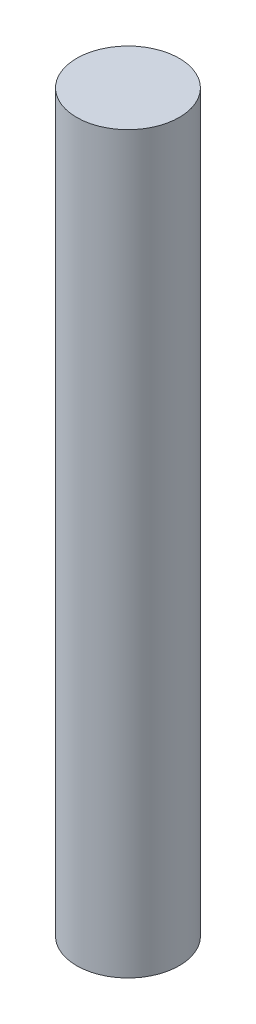
ISO-10303-21;
HEADER;
FILE_DESCRIPTION(('STEP AP214'),'2;1');
FILE_NAME('part.step','',(''),(''),'','','');
FILE_SCHEMA(('AUTOMOTIVE_DESIGN { 1 0 10303 214 1 1 1 1 }'));
ENDSEC;
DATA;
#1=APPLICATION_CONTEXT('core data for automotive mechanical design processes');
#2=APPLICATION_PROTOCOL_DEFINITION('international standard','automotive_design',2000,#1);
#3=PRODUCT_CONTEXT('',#1,'mechanical');
#4=PRODUCT('Part','Part','',(#3));
#5=PRODUCT_RELATED_PRODUCT_CATEGORY('part','',(#4));
#6=PRODUCT_DEFINITION_FORMATION('','',#4);
#7=PRODUCT_DEFINITION_CONTEXT('part definition',#1,'design');
#8=PRODUCT_DEFINITION('design','',#6,#7);
#9=PRODUCT_DEFINITION_SHAPE('','',#8);
#10=(LENGTH_UNIT() NAMED_UNIT(*) SI_UNIT(.MILLI.,.METRE.));
#11=(NAMED_UNIT(*) PLANE_ANGLE_UNIT() SI_UNIT($,.RADIAN.));
#12=(NAMED_UNIT(*) SI_UNIT($,.STERADIAN.) SOLID_ANGLE_UNIT());
#13=UNCERTAINTY_MEASURE_WITH_UNIT(LENGTH_MEASURE(1.E-05),#10,'distance_accuracy_value','');
#14=(GEOMETRIC_REPRESENTATION_CONTEXT(3) GLOBAL_UNCERTAINTY_ASSIGNED_CONTEXT((#13)) GLOBAL_UNIT_ASSIGNED_CONTEXT((#10,
#11,#12)) REPRESENTATION_CONTEXT('',''));
#15=CARTESIAN_POINT('',(0.,0.,0.));
#16=DIRECTION('',(0.,0.,1.));
#17=DIRECTION('',(1.,0.,0.));
#18=AXIS2_PLACEMENT_3D('',#15,#16,#17);
#19=CARTESIAN_POINT('',(0.,21.5,0.));
#20=DIRECTION('',(0.,-1.,0.));
#21=DIRECTION('',(0.,0.,-1.));
#22=AXIS2_PLACEMENT_3D('',#19,#20,#21);
#23=CYLINDRICAL_SURFACE('',#22,1.5);
#24=CARTESIAN_POINT('',(0.,21.5,0.));
#25=DIRECTION('',(0.,1.,0.));
#26=DIRECTION('',(0.,0.,1.));
#27=AXIS2_PLACEMENT_3D('',#24,#25,#26);
#28=CIRCLE('',#27,1.5);
#29=CARTESIAN_POINT('',(0.,21.5,1.5));
#30=VERTEX_POINT('',#29);
#31=EDGE_CURVE('E10',#30,#30,#28,.T.);
#32=ORIENTED_EDGE('',*,*,#31,.F.);
#33=EDGE_LOOP('',(#32));
#34=FACE_BOUND('',#33,.T.);
#35=CARTESIAN_POINT('',(0.,0.,0.));
#36=DIRECTION('',(0.,1.,0.));
#37=DIRECTION('',(0.,0.,1.));
#38=AXIS2_PLACEMENT_3D('',#35,#36,#37);
#39=CIRCLE('',#38,1.5);
#40=CARTESIAN_POINT('',(0.,0.,1.5));
#41=VERTEX_POINT('',#40);
#42=EDGE_CURVE('E37',#41,#41,#39,.T.);
#43=ORIENTED_EDGE('',*,*,#42,.T.);
#44=EDGE_LOOP('',(#43));
#45=FACE_BOUND('',#44,.T.);
#46=ADVANCED_FACE('F34',(#34,#45),#23,.T.);
#47=CARTESIAN_POINT('',(0.,21.5,0.));
#48=DIRECTION('',(0.,1.,0.));
#49=DIRECTION('',(0.,0.,1.));
#50=AXIS2_PLACEMENT_3D('',#47,#48,#49);
#51=PLANE('',#50);
#52=ORIENTED_EDGE('',*,*,#31,.T.);
#53=EDGE_LOOP('',(#52));
#54=FACE_BOUND('',#53,.T.);
#55=ADVANCED_FACE('F49',(#54),#51,.T.);
#56=CARTESIAN_POINT('',(0.,0.,0.));
#57=DIRECTION('',(0.,1.,0.));
#58=DIRECTION('',(0.,0.,1.));
#59=AXIS2_PLACEMENT_3D('',#56,#57,#58);
#60=PLANE('',#59);
#61=ORIENTED_EDGE('',*,*,#42,.F.);
#62=EDGE_LOOP('',(#61));
#63=FACE_BOUND('',#62,.T.);
#64=ADVANCED_FACE('F47',(#63),#60,.F.);
#65=CLOSED_SHELL('',(#46,#55,#64));
#66=MANIFOLD_SOLID_BREP('B2',#65);
#67=ADVANCED_BREP_SHAPE_REPRESENTATION('',(#18,#66),#14);
#68=SHAPE_DEFINITION_REPRESENTATION(#9,#67);
ENDSEC;
END-ISO-10303-21;
